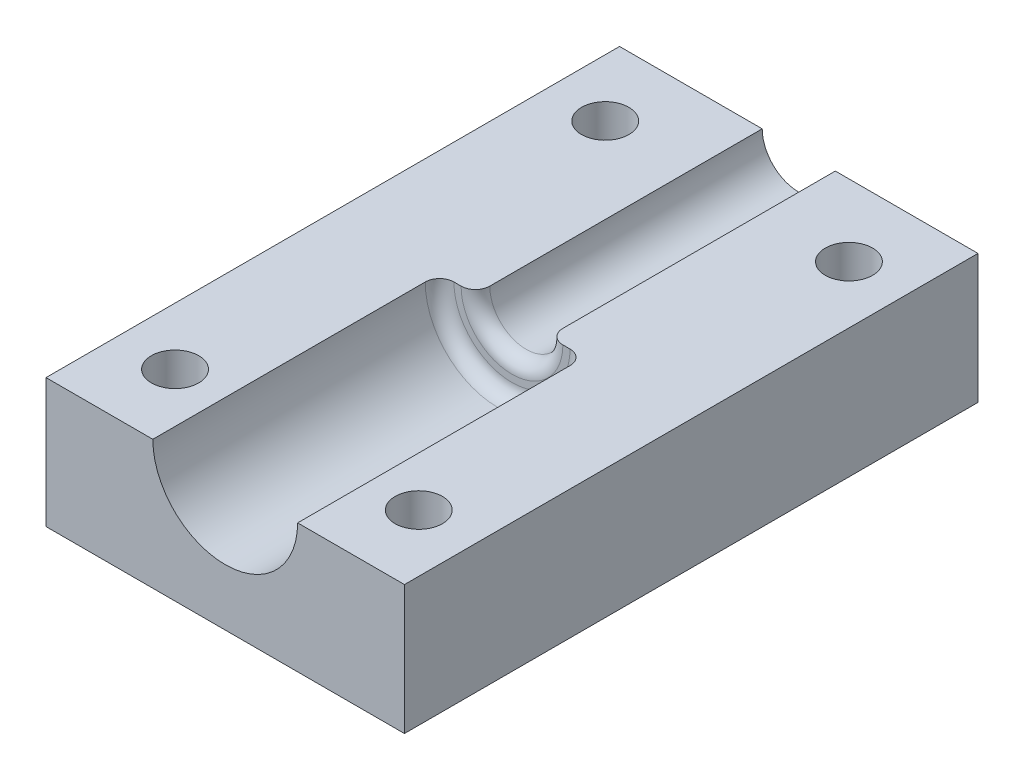
ISO-10303-21;
HEADER;
FILE_DESCRIPTION(('STEP AP214'),'2;1');
FILE_NAME('part.step','',(''),(''),'','','');
FILE_SCHEMA(('AUTOMOTIVE_DESIGN { 1 0 10303 214 1 1 1 1 }'));
ENDSEC;
DATA;
#1=APPLICATION_CONTEXT('core data for automotive mechanical design processes');
#2=APPLICATION_PROTOCOL_DEFINITION('international standard','automotive_design',2000,#1);
#3=PRODUCT_CONTEXT('',#1,'mechanical');
#4=PRODUCT('Part','Part','',(#3));
#5=PRODUCT_RELATED_PRODUCT_CATEGORY('part','',(#4));
#6=PRODUCT_DEFINITION_FORMATION('','',#4);
#7=PRODUCT_DEFINITION_CONTEXT('part definition',#1,'design');
#8=PRODUCT_DEFINITION('design','',#6,#7);
#9=PRODUCT_DEFINITION_SHAPE('','',#8);
#10=(LENGTH_UNIT() NAMED_UNIT(*) SI_UNIT(.MILLI.,.METRE.));
#11=(NAMED_UNIT(*) PLANE_ANGLE_UNIT() SI_UNIT($,.RADIAN.));
#12=(NAMED_UNIT(*) SI_UNIT($,.STERADIAN.) SOLID_ANGLE_UNIT());
#13=UNCERTAINTY_MEASURE_WITH_UNIT(LENGTH_MEASURE(1.E-05),#10,'distance_accuracy_value','');
#14=(GEOMETRIC_REPRESENTATION_CONTEXT(3) GLOBAL_UNCERTAINTY_ASSIGNED_CONTEXT((#13)) GLOBAL_UNIT_ASSIGNED_CONTEXT((#10,
#11,#12)) REPRESENTATION_CONTEXT('',''));
#15=CARTESIAN_POINT('',(0.,0.,0.));
#16=DIRECTION('',(0.,0.,1.));
#17=DIRECTION('',(1.,0.,0.));
#18=AXIS2_PLACEMENT_3D('',#15,#16,#17);
#19=CARTESIAN_POINT('',(0.,9.,0.));
#20=DIRECTION('',(0.,0.,-1.));
#21=DIRECTION('',(-1.,0.,0.));
#22=AXIS2_PLACEMENT_3D('',#19,#20,#21);
#23=PLANE('',#22);
#24=CARTESIAN_POINT('',(12.5,9.,0.));
#25=DIRECTION('',(0.,0.,-1.));
#26=DIRECTION('',(-1.,0.,0.));
#27=AXIS2_PLACEMENT_3D('',#24,#25,#26);
#28=CIRCLE('',#27,5.05);
#29=CARTESIAN_POINT('',(17.55,9.,0.));
#30=VERTEX_POINT('',#29);
#31=CARTESIAN_POINT('',(7.45,9.,0.));
#32=VERTEX_POINT('',#31);
#33=EDGE_CURVE('E116',#30,#32,#28,.T.);
#34=ORIENTED_EDGE('',*,*,#33,.T.);
#35=DIRECTION('',(1.,0.,0.));
#36=VECTOR('',#35,1.);
#37=CARTESIAN_POINT('',(0.,9.,0.));
#38=LINE('',#37,#36);
#39=CARTESIAN_POINT('',(0.,9.,0.));
#40=VERTEX_POINT('',#39);
#41=EDGE_CURVE('E127',#40,#32,#38,.T.);
#42=ORIENTED_EDGE('',*,*,#41,.F.);
#43=DIRECTION('',(0.,-1.,0.));
#44=VECTOR('',#43,1.);
#45=CARTESIAN_POINT('',(0.,9.,0.));
#46=LINE('',#45,#44);
#47=CARTESIAN_POINT('',(0.,0.,0.));
#48=VERTEX_POINT('',#47);
#49=EDGE_CURVE('E178',#40,#48,#46,.T.);
#50=ORIENTED_EDGE('',*,*,#49,.T.);
#51=DIRECTION('',(1.,0.,0.));
#52=VECTOR('',#51,1.);
#53=CARTESIAN_POINT('',(0.,0.,0.));
#54=LINE('',#53,#52);
#55=CARTESIAN_POINT('',(25.,0.,0.));
#56=VERTEX_POINT('',#55);
#57=EDGE_CURVE('E161',#48,#56,#54,.T.);
#58=ORIENTED_EDGE('',*,*,#57,.T.);
#59=DIRECTION('',(0.,-1.,0.));
#60=VECTOR('',#59,1.);
#61=CARTESIAN_POINT('',(25.,9.,0.));
#62=LINE('',#61,#60);
#63=CARTESIAN_POINT('',(25.,9.,0.));
#64=VERTEX_POINT('',#63);
#65=EDGE_CURVE('E152',#64,#56,#62,.T.);
#66=ORIENTED_EDGE('',*,*,#65,.F.);
#67=EDGE_CURVE('E129',#30,#64,#38,.T.);
#68=ORIENTED_EDGE('',*,*,#67,.F.);
#69=EDGE_LOOP('',(#34,#42,#50,#58,#66,#68));
#70=FACE_BOUND('',#69,.T.);
#71=ADVANCED_FACE('F35',(#70),#23,.F.);
#72=CARTESIAN_POINT('',(0.,9.,0.));
#73=DIRECTION('',(0.,1.,0.));
#74=DIRECTION('',(0.,0.,1.));
#75=AXIS2_PLACEMENT_3D('',#72,#73,#74);
#76=PLANE('',#75);
#77=CARTESIAN_POINT('',(21.,9.,-35.));
#78=DIRECTION('',(0.,1.,0.));
#79=DIRECTION('',(0.,0.,1.));
#80=AXIS2_PLACEMENT_3D('',#77,#78,#79);
#81=CIRCLE('',#80,1.65);
#82=CARTESIAN_POINT('',(21.,9.,-33.35));
#83=VERTEX_POINT('',#82);
#84=EDGE_CURVE('E149',#83,#83,#81,.T.);
#85=ORIENTED_EDGE('',*,*,#84,.F.);
#86=EDGE_LOOP('',(#85));
#87=FACE_BOUND('',#86,.T.);
#88=CARTESIAN_POINT('',(21.,9.,-5.));
#89=DIRECTION('',(0.,1.,0.));
#90=DIRECTION('',(0.,0.,1.));
#91=AXIS2_PLACEMENT_3D('',#88,#89,#90);
#92=CIRCLE('',#91,1.65);
#93=CARTESIAN_POINT('',(21.,9.,-3.35));
#94=VERTEX_POINT('',#93);
#95=EDGE_CURVE('E146',#94,#94,#92,.F.);
#96=ORIENTED_EDGE('',*,*,#95,.T.);
#97=EDGE_LOOP('',(#96));
#98=FACE_BOUND('',#97,.T.);
#99=DIRECTION('',(0.,0.,-1.));
#100=VECTOR('',#99,1.);
#101=CARTESIAN_POINT('',(15.05,9.,-20.));
#102=LINE('',#101,#100);
#103=CARTESIAN_POINT('',(15.05,9.,-21.));
#104=VERTEX_POINT('',#103);
#105=CARTESIAN_POINT('',(15.05,9.,-40.));
#106=VERTEX_POINT('',#105);
#107=EDGE_CURVE('E157',#104,#106,#102,.T.);
#108=ORIENTED_EDGE('',*,*,#107,.F.);
#109=CARTESIAN_POINT('',(16.05,9.,-21.));
#110=DIRECTION('',(0.,1.,0.));
#111=DIRECTION('',(0.,0.,1.));
#112=AXIS2_PLACEMENT_3D('',#109,#110,#111);
#113=CIRCLE('',#112,1.);
#114=CARTESIAN_POINT('',(16.05,9.,-20.));
#115=VERTEX_POINT('',#114);
#116=EDGE_CURVE('E194',#104,#115,#113,.T.);
#117=ORIENTED_EDGE('',*,*,#116,.T.);
#118=DIRECTION('',(-1.,0.,0.));
#119=VECTOR('',#118,1.);
#120=CARTESIAN_POINT('',(17.55,9.,-20.));
#121=LINE('',#120,#119);
#122=CARTESIAN_POINT('',(16.55,9.,-20.));
#123=VERTEX_POINT('',#122);
#124=EDGE_CURVE('E203',#123,#115,#121,.T.);
#125=ORIENTED_EDGE('',*,*,#124,.F.);
#126=CARTESIAN_POINT('',(16.55,9.,-19.));
#127=DIRECTION('',(0.,1.,0.));
#128=DIRECTION('',(0.,0.,1.));
#129=AXIS2_PLACEMENT_3D('',#126,#127,#128);
#130=CIRCLE('',#129,1.);
#131=CARTESIAN_POINT('',(17.55,9.,-19.));
#132=VERTEX_POINT('',#131);
#133=EDGE_CURVE('E11',#123,#132,#130,.F.);
#134=ORIENTED_EDGE('',*,*,#133,.T.);
#135=DIRECTION('',(0.,0.,1.));
#136=VECTOR('',#135,1.);
#137=CARTESIAN_POINT('',(17.55,9.,-20.));
#138=LINE('',#137,#136);
#139=EDGE_CURVE('E122',#132,#30,#138,.T.);
#140=ORIENTED_EDGE('',*,*,#139,.T.);
#141=ORIENTED_EDGE('',*,*,#67,.T.);
#142=DIRECTION('',(0.,0.,-1.));
#143=VECTOR('',#142,1.);
#144=CARTESIAN_POINT('',(25.,9.,0.));
#145=LINE('',#144,#143);
#146=CARTESIAN_POINT('',(25.,9.,-40.));
#147=VERTEX_POINT('',#146);
#148=EDGE_CURVE('E175',#64,#147,#145,.T.);
#149=ORIENTED_EDGE('',*,*,#148,.T.);
#150=DIRECTION('',(-1.,0.,0.));
#151=VECTOR('',#150,1.);
#152=CARTESIAN_POINT('',(0.,9.,-40.));
#153=LINE('',#152,#151);
#154=EDGE_CURVE('E218',#147,#106,#153,.T.);
#155=ORIENTED_EDGE('',*,*,#154,.T.);
#156=EDGE_LOOP('',(#108,#117,#125,#134,#140,#141,#149,#155));
#157=FACE_BOUND('',#156,.T.);
#158=ADVANCED_FACE('F208',(#87,#98,#157),#76,.T.);
#159=CARTESIAN_POINT('',(4.,9.,-35.));
#160=DIRECTION('',(0.,1.,0.));
#161=DIRECTION('',(0.,0.,1.));
#162=AXIS2_PLACEMENT_3D('',#159,#160,#161);
#163=CIRCLE('',#162,1.65);
#164=CARTESIAN_POINT('',(4.,9.,-33.35));
#165=VERTEX_POINT('',#164);
#166=EDGE_CURVE('E139',#165,#165,#163,.F.);
#167=ORIENTED_EDGE('',*,*,#166,.T.);
#168=EDGE_LOOP('',(#167));
#169=FACE_BOUND('',#168,.T.);
#170=CARTESIAN_POINT('',(4.,9.,-5.));
#171=DIRECTION('',(0.,1.,0.));
#172=DIRECTION('',(0.,0.,1.));
#173=AXIS2_PLACEMENT_3D('',#170,#171,#172);
#174=CIRCLE('',#173,1.65);
#175=CARTESIAN_POINT('',(4.,9.,-3.35));
#176=VERTEX_POINT('',#175);
#177=EDGE_CURVE('E136',#176,#176,#174,.T.);
#178=ORIENTED_EDGE('',*,*,#177,.F.);
#179=EDGE_LOOP('',(#178));
#180=FACE_BOUND('',#179,.T.);
#181=CARTESIAN_POINT('',(8.95,9.,-20.));
#182=VERTEX_POINT('',#181);
#183=CARTESIAN_POINT('',(8.45,9.,-20.));
#184=VERTEX_POINT('',#183);
#185=EDGE_CURVE('E130',#182,#184,#121,.T.);
#186=ORIENTED_EDGE('',*,*,#185,.F.);
#187=CARTESIAN_POINT('',(8.95,9.,-21.));
#188=DIRECTION('',(0.,1.,0.));
#189=DIRECTION('',(0.,0.,1.));
#190=AXIS2_PLACEMENT_3D('',#187,#188,#189);
#191=CIRCLE('',#190,1.);
#192=CARTESIAN_POINT('',(9.95,9.,-21.));
#193=VERTEX_POINT('',#192);
#194=EDGE_CURVE('E58',#182,#193,#191,.T.);
#195=ORIENTED_EDGE('',*,*,#194,.T.);
#196=DIRECTION('',(0.,0.,-1.));
#197=VECTOR('',#196,1.);
#198=CARTESIAN_POINT('',(9.95,9.,-20.));
#199=LINE('',#198,#197);
#200=CARTESIAN_POINT('',(9.95,9.,-40.));
#201=VERTEX_POINT('',#200);
#202=EDGE_CURVE('E213',#193,#201,#199,.T.);
#203=ORIENTED_EDGE('',*,*,#202,.T.);
#204=CARTESIAN_POINT('',(0.,9.,-40.));
#205=VERTEX_POINT('',#204);
#206=EDGE_CURVE('E217',#201,#205,#153,.T.);
#207=ORIENTED_EDGE('',*,*,#206,.T.);
#208=DIRECTION('',(0.,0.,1.));
#209=VECTOR('',#208,1.);
#210=CARTESIAN_POINT('',(0.,9.,0.));
#211=LINE('',#210,#209);
#212=EDGE_CURVE('E134',#205,#40,#211,.T.);
#213=ORIENTED_EDGE('',*,*,#212,.T.);
#214=ORIENTED_EDGE('',*,*,#41,.T.);
#215=DIRECTION('',(0.,0.,1.));
#216=VECTOR('',#215,1.);
#217=CARTESIAN_POINT('',(7.45,9.,-20.));
#218=LINE('',#217,#216);
#219=CARTESIAN_POINT('',(7.45,9.,-19.));
#220=VERTEX_POINT('',#219);
#221=EDGE_CURVE('E112',#220,#32,#218,.T.);
#222=ORIENTED_EDGE('',*,*,#221,.F.);
#223=CARTESIAN_POINT('',(8.45,9.,-19.));
#224=DIRECTION('',(0.,1.,0.));
#225=DIRECTION('',(0.,0.,1.));
#226=AXIS2_PLACEMENT_3D('',#223,#224,#225);
#227=CIRCLE('',#226,1.);
#228=EDGE_CURVE('E43',#220,#184,#227,.F.);
#229=ORIENTED_EDGE('',*,*,#228,.T.);
#230=EDGE_LOOP('',(#186,#195,#203,#207,#213,#214,#222,#229));
#231=FACE_BOUND('',#230,.T.);
#232=ADVANCED_FACE('F132',(#169,#180,#231),#76,.T.);
#233=CARTESIAN_POINT('',(25.,9.,0.));
#234=DIRECTION('',(-1.,0.,0.));
#235=DIRECTION('',(0.,0.,1.));
#236=AXIS2_PLACEMENT_3D('',#233,#234,#235);
#237=PLANE('',#236);
#238=DIRECTION('',(0.,0.,-1.));
#239=VECTOR('',#238,1.);
#240=CARTESIAN_POINT('',(25.,0.,0.));
#241=LINE('',#240,#239);
#242=CARTESIAN_POINT('',(25.,0.,-40.));
#243=VERTEX_POINT('',#242);
#244=EDGE_CURVE('E153',#56,#243,#241,.T.);
#245=ORIENTED_EDGE('',*,*,#244,.T.);
#246=DIRECTION('',(0.,-1.,0.));
#247=VECTOR('',#246,1.);
#248=CARTESIAN_POINT('',(25.,9.,-40.));
#249=LINE('',#248,#247);
#250=EDGE_CURVE('E183',#147,#243,#249,.T.);
#251=ORIENTED_EDGE('',*,*,#250,.F.);
#252=ORIENTED_EDGE('',*,*,#148,.F.);
#253=ORIENTED_EDGE('',*,*,#65,.T.);
#254=EDGE_LOOP('',(#245,#251,#252,#253));
#255=FACE_BOUND('',#254,.T.);
#256=ADVANCED_FACE('F235',(#255),#237,.F.);
#257=CARTESIAN_POINT('',(0.,9.,-40.));
#258=DIRECTION('',(0.,0.,1.));
#259=DIRECTION('',(1.,0.,0.));
#260=AXIS2_PLACEMENT_3D('',#257,#258,#259);
#261=PLANE('',#260);
#262=ORIENTED_EDGE('',*,*,#206,.F.);
#263=CARTESIAN_POINT('',(12.5,9.,-40.));
#264=DIRECTION('',(0.,0.,-1.));
#265=DIRECTION('',(1.,0.,0.));
#266=AXIS2_PLACEMENT_3D('',#263,#264,#265);
#267=CIRCLE('',#266,2.55);
#268=EDGE_CURVE('E121',#106,#201,#267,.T.);
#269=ORIENTED_EDGE('',*,*,#268,.F.);
#270=ORIENTED_EDGE('',*,*,#154,.F.);
#271=ORIENTED_EDGE('',*,*,#250,.T.);
#272=DIRECTION('',(-1.,0.,0.));
#273=VECTOR('',#272,1.);
#274=CARTESIAN_POINT('',(0.,0.,-40.));
#275=LINE('',#274,#273);
#276=CARTESIAN_POINT('',(0.,0.,-40.));
#277=VERTEX_POINT('',#276);
#278=EDGE_CURVE('E156',#243,#277,#275,.T.);
#279=ORIENTED_EDGE('',*,*,#278,.T.);
#280=DIRECTION('',(0.,-1.,0.));
#281=VECTOR('',#280,1.);
#282=CARTESIAN_POINT('',(0.,9.,-40.));
#283=LINE('',#282,#281);
#284=EDGE_CURVE('E180',#205,#277,#283,.T.);
#285=ORIENTED_EDGE('',*,*,#284,.F.);
#286=EDGE_LOOP('',(#262,#269,#270,#271,#279,#285));
#287=FACE_BOUND('',#286,.T.);
#288=ADVANCED_FACE('F224',(#287),#261,.F.);
#289=CARTESIAN_POINT('',(0.,9.,0.));
#290=DIRECTION('',(1.,0.,0.));
#291=DIRECTION('',(0.,0.,-1.));
#292=AXIS2_PLACEMENT_3D('',#289,#290,#291);
#293=PLANE('',#292);
#294=DIRECTION('',(0.,0.,1.));
#295=VECTOR('',#294,1.);
#296=CARTESIAN_POINT('',(0.,0.,0.));
#297=LINE('',#296,#295);
#298=EDGE_CURVE('E159',#277,#48,#297,.T.);
#299=ORIENTED_EDGE('',*,*,#298,.T.);
#300=ORIENTED_EDGE('',*,*,#49,.F.);
#301=ORIENTED_EDGE('',*,*,#212,.F.);
#302=ORIENTED_EDGE('',*,*,#284,.T.);
#303=EDGE_LOOP('',(#299,#300,#301,#302));
#304=FACE_BOUND('',#303,.T.);
#305=ADVANCED_FACE('F227',(#304),#293,.F.);
#306=CARTESIAN_POINT('',(21.,9.,-5.));
#307=DIRECTION('',(0.,-1.,0.));
#308=DIRECTION('',(0.,0.,-1.));
#309=AXIS2_PLACEMENT_3D('',#306,#307,#308);
#310=CYLINDRICAL_SURFACE('',#309,1.65);
#311=ORIENTED_EDGE('',*,*,#95,.F.);
#312=EDGE_LOOP('',(#311));
#313=FACE_BOUND('',#312,.T.);
#314=CARTESIAN_POINT('',(21.,0.,-5.));
#315=DIRECTION('',(0.,1.,0.));
#316=DIRECTION('',(0.,0.,1.));
#317=AXIS2_PLACEMENT_3D('',#314,#315,#316);
#318=CIRCLE('',#317,1.65);
#319=CARTESIAN_POINT('',(21.,0.,-3.35));
#320=VERTEX_POINT('',#319);
#321=EDGE_CURVE('E169',#320,#320,#318,.F.);
#322=ORIENTED_EDGE('',*,*,#321,.T.);
#323=EDGE_LOOP('',(#322));
#324=FACE_BOUND('',#323,.T.);
#325=ADVANCED_FACE('F257',(#313,#324),#310,.F.);
#326=CARTESIAN_POINT('',(4.,9.,-35.));
#327=DIRECTION('',(0.,-1.,0.));
#328=DIRECTION('',(0.,0.,-1.));
#329=AXIS2_PLACEMENT_3D('',#326,#327,#328);
#330=CYLINDRICAL_SURFACE('',#329,1.65);
#331=ORIENTED_EDGE('',*,*,#166,.F.);
#332=EDGE_LOOP('',(#331));
#333=FACE_BOUND('',#332,.T.);
#334=CARTESIAN_POINT('',(4.,0.,-35.));
#335=DIRECTION('',(0.,1.,0.));
#336=DIRECTION('',(0.,0.,1.));
#337=AXIS2_PLACEMENT_3D('',#334,#335,#336);
#338=CIRCLE('',#337,1.65);
#339=CARTESIAN_POINT('',(4.,0.,-33.35));
#340=VERTEX_POINT('',#339);
#341=EDGE_CURVE('E166',#340,#340,#338,.F.);
#342=ORIENTED_EDGE('',*,*,#341,.T.);
#343=EDGE_LOOP('',(#342));
#344=FACE_BOUND('',#343,.T.);
#345=ADVANCED_FACE('F278',(#333,#344),#330,.F.);
#346=CARTESIAN_POINT('',(4.,9.,-5.));
#347=DIRECTION('',(0.,-1.,0.));
#348=DIRECTION('',(0.,0.,-1.));
#349=AXIS2_PLACEMENT_3D('',#346,#347,#348);
#350=CYLINDRICAL_SURFACE('',#349,1.65);
#351=ORIENTED_EDGE('',*,*,#177,.T.);
#352=EDGE_LOOP('',(#351));
#353=FACE_BOUND('',#352,.T.);
#354=CARTESIAN_POINT('',(4.,0.,-5.));
#355=DIRECTION('',(0.,1.,0.));
#356=DIRECTION('',(0.,0.,1.));
#357=AXIS2_PLACEMENT_3D('',#354,#355,#356);
#358=CIRCLE('',#357,1.65);
#359=CARTESIAN_POINT('',(4.,0.,-3.35));
#360=VERTEX_POINT('',#359);
#361=EDGE_CURVE('E163',#360,#360,#358,.T.);
#362=ORIENTED_EDGE('',*,*,#361,.F.);
#363=EDGE_LOOP('',(#362));
#364=FACE_BOUND('',#363,.T.);
#365=ADVANCED_FACE('F253',(#353,#364),#350,.F.);
#366=CARTESIAN_POINT('',(21.,9.,-35.));
#367=DIRECTION('',(0.,-1.,0.));
#368=DIRECTION('',(0.,0.,-1.));
#369=AXIS2_PLACEMENT_3D('',#366,#367,#368);
#370=CYLINDRICAL_SURFACE('',#369,1.65);
#371=ORIENTED_EDGE('',*,*,#84,.T.);
#372=EDGE_LOOP('',(#371));
#373=FACE_BOUND('',#372,.T.);
#374=CARTESIAN_POINT('',(21.,0.,-35.));
#375=DIRECTION('',(0.,1.,0.));
#376=DIRECTION('',(0.,0.,1.));
#377=AXIS2_PLACEMENT_3D('',#374,#375,#376);
#378=CIRCLE('',#377,1.65);
#379=CARTESIAN_POINT('',(21.,0.,-33.35));
#380=VERTEX_POINT('',#379);
#381=EDGE_CURVE('E172',#380,#380,#378,.T.);
#382=ORIENTED_EDGE('',*,*,#381,.F.);
#383=EDGE_LOOP('',(#382));
#384=FACE_BOUND('',#383,.T.);
#385=ADVANCED_FACE('F273',(#373,#384),#370,.F.);
#386=CARTESIAN_POINT('',(0.,0.,0.));
#387=DIRECTION('',(0.,1.,0.));
#388=DIRECTION('',(0.,0.,1.));
#389=AXIS2_PLACEMENT_3D('',#386,#387,#388);
#390=PLANE('',#389);
#391=ORIENTED_EDGE('',*,*,#244,.F.);
#392=ORIENTED_EDGE('',*,*,#57,.F.);
#393=ORIENTED_EDGE('',*,*,#298,.F.);
#394=ORIENTED_EDGE('',*,*,#278,.F.);
#395=EDGE_LOOP('',(#391,#392,#393,#394));
#396=FACE_BOUND('',#395,.T.);
#397=ORIENTED_EDGE('',*,*,#361,.T.);
#398=EDGE_LOOP('',(#397));
#399=FACE_BOUND('',#398,.T.);
#400=ORIENTED_EDGE('',*,*,#341,.F.);
#401=EDGE_LOOP('',(#400));
#402=FACE_BOUND('',#401,.T.);
#403=ORIENTED_EDGE('',*,*,#321,.F.);
#404=EDGE_LOOP('',(#403));
#405=FACE_BOUND('',#404,.T.);
#406=ORIENTED_EDGE('',*,*,#381,.T.);
#407=EDGE_LOOP('',(#406));
#408=FACE_BOUND('',#407,.T.);
#409=ADVANCED_FACE('F231',(#396,#399,#402,#405,#408),#390,.F.);
#410=CARTESIAN_POINT('',(12.5,9.,-20.));
#411=DIRECTION('',(0.,0.,-1.));
#412=DIRECTION('',(-1.,0.,0.));
#413=AXIS2_PLACEMENT_3D('',#410,#411,#412);
#414=CYLINDRICAL_SURFACE('',#413,2.55);
#415=ORIENTED_EDGE('',*,*,#202,.F.);
#416=CARTESIAN_POINT('',(12.5,9.,-21.));
#417=DIRECTION('',(0.,0.,-1.));
#418=DIRECTION('',(-1.,0.,0.));
#419=AXIS2_PLACEMENT_3D('',#416,#417,#418);
#420=CIRCLE('',#419,2.55);
#421=EDGE_CURVE('E50',#193,#104,#420,.F.);
#422=ORIENTED_EDGE('',*,*,#421,.T.);
#423=ORIENTED_EDGE('',*,*,#107,.T.);
#424=ORIENTED_EDGE('',*,*,#268,.T.);
#425=EDGE_LOOP('',(#415,#422,#423,#424));
#426=FACE_BOUND('',#425,.T.);
#427=ADVANCED_FACE('F237',(#426),#414,.F.);
#428=CARTESIAN_POINT('',(12.5,9.,-20.));
#429=DIRECTION('',(0.,0.,-1.));
#430=DIRECTION('',(-1.,0.,0.));
#431=AXIS2_PLACEMENT_3D('',#428,#429,#430);
#432=PLANE('',#431);
#433=ORIENTED_EDGE('',*,*,#185,.T.);
#434=CARTESIAN_POINT('',(12.5,9.,-20.));
#435=DIRECTION('',(0.,0.,-1.));
#436=DIRECTION('',(-1.,0.,0.));
#437=AXIS2_PLACEMENT_3D('',#434,#435,#436);
#438=CIRCLE('',#437,4.05);
#439=EDGE_CURVE('E190',#184,#123,#438,.F.);
#440=ORIENTED_EDGE('',*,*,#439,.T.);
#441=ORIENTED_EDGE('',*,*,#124,.T.);
#442=CARTESIAN_POINT('',(12.5,9.,-20.));
#443=DIRECTION('',(0.,0.,-1.));
#444=DIRECTION('',(-1.,0.,0.));
#445=AXIS2_PLACEMENT_3D('',#442,#443,#444);
#446=CIRCLE('',#445,3.55);
#447=EDGE_CURVE('E187',#115,#182,#446,.T.);
#448=ORIENTED_EDGE('',*,*,#447,.T.);
#449=EDGE_LOOP('',(#433,#440,#441,#448));
#450=FACE_BOUND('',#449,.T.);
#451=ADVANCED_FACE('F199',(#450),#432,.F.);
#452=CARTESIAN_POINT('',(12.5,9.,-20.));
#453=DIRECTION('',(0.,0.,1.));
#454=DIRECTION('',(1.,0.,0.));
#455=AXIS2_PLACEMENT_3D('',#452,#453,#454);
#456=CYLINDRICAL_SURFACE('',#455,5.05);
#457=ORIENTED_EDGE('',*,*,#139,.F.);
#458=CARTESIAN_POINT('',(12.5,9.,-19.));
#459=DIRECTION('',(0.,0.,-1.));
#460=DIRECTION('',(-1.,0.,0.));
#461=AXIS2_PLACEMENT_3D('',#458,#459,#460);
#462=CIRCLE('',#461,5.05);
#463=EDGE_CURVE('E119',#132,#220,#462,.T.);
#464=ORIENTED_EDGE('',*,*,#463,.T.);
#465=ORIENTED_EDGE('',*,*,#221,.T.);
#466=ORIENTED_EDGE('',*,*,#33,.F.);
#467=EDGE_LOOP('',(#457,#464,#465,#466));
#468=FACE_BOUND('',#467,.T.);
#469=ADVANCED_FACE('F115',(#468),#456,.F.);
#470=CARTESIAN_POINT('',(12.5,9.,-19.));
#471=DIRECTION('',(0.,0.,-1.));
#472=DIRECTION('',(-1.,0.,0.));
#473=AXIS2_PLACEMENT_3D('',#470,#471,#472);
#474=TOROIDAL_SURFACE('',#473,4.05,1.);
#475=ORIENTED_EDGE('',*,*,#133,.F.);
#476=ORIENTED_EDGE('',*,*,#439,.F.);
#477=ORIENTED_EDGE('',*,*,#228,.F.);
#478=ORIENTED_EDGE('',*,*,#463,.F.);
#479=EDGE_LOOP('',(#475,#476,#477,#478));
#480=FACE_BOUND('',#479,.T.);
#481=ADVANCED_FACE('F206',(#480),#474,.F.);
#482=CARTESIAN_POINT('',(12.5,9.,-21.));
#483=DIRECTION('',(0.,0.,-1.));
#484=DIRECTION('',(-1.,0.,0.));
#485=AXIS2_PLACEMENT_3D('',#482,#483,#484);
#486=TOROIDAL_SURFACE('',#485,3.55,1.);
#487=ORIENTED_EDGE('',*,*,#116,.F.);
#488=ORIENTED_EDGE('',*,*,#421,.F.);
#489=ORIENTED_EDGE('',*,*,#194,.F.);
#490=ORIENTED_EDGE('',*,*,#447,.F.);
#491=EDGE_LOOP('',(#487,#488,#489,#490));
#492=FACE_BOUND('',#491,.T.);
#493=ADVANCED_FACE('F37',(#492),#486,.T.);
#494=CLOSED_SHELL('',(#71,#158,#232,#256,#288,#305,#325,#345,#365,#385,#409,#427,#451,#469,#481,#493));
#495=MANIFOLD_SOLID_BREP('B2',#494);
#496=ADVANCED_BREP_SHAPE_REPRESENTATION('',(#18,#495),#14);
#497=SHAPE_DEFINITION_REPRESENTATION(#9,#496);
ENDSEC;
END-ISO-10303-21;
